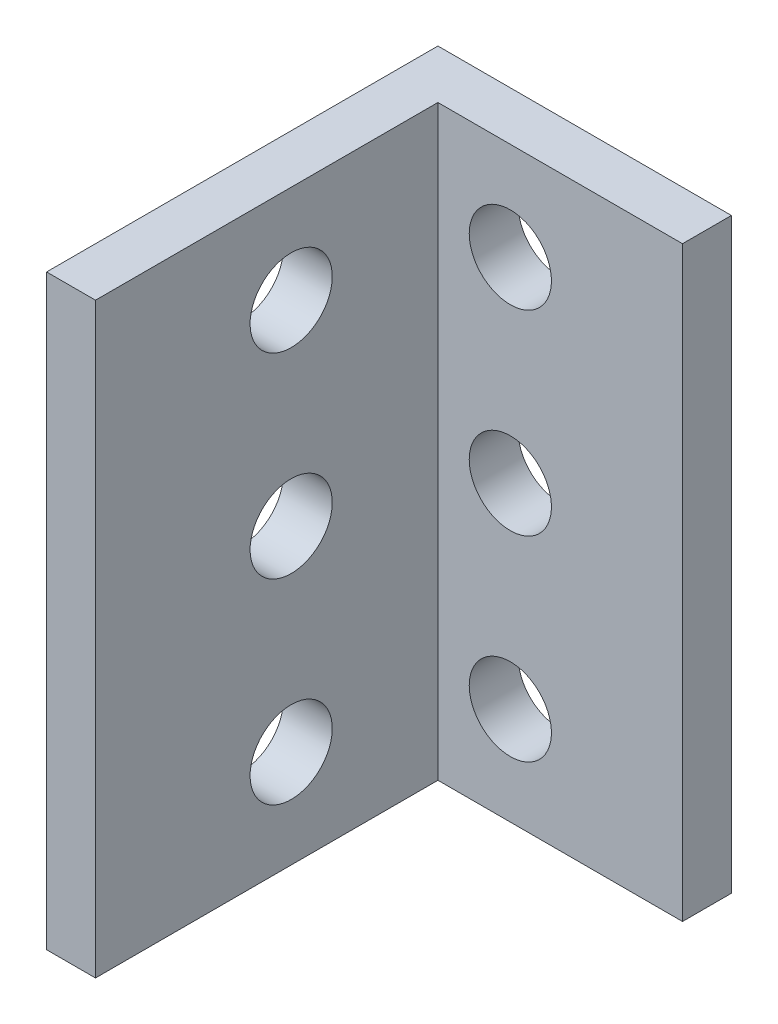
ISO-10303-21;
HEADER;
FILE_DESCRIPTION(('STEP AP214'),'2;1');
FILE_NAME('part.step','',(''),(''),'','','');
FILE_SCHEMA(('AUTOMOTIVE_DESIGN { 1 0 10303 214 1 1 1 1 }'));
ENDSEC;
DATA;
#1=APPLICATION_CONTEXT('core data for automotive mechanical design processes');
#2=APPLICATION_PROTOCOL_DEFINITION('international standard','automotive_design',2000,#1);
#3=PRODUCT_CONTEXT('',#1,'mechanical');
#4=PRODUCT('Part','Part','',(#3));
#5=PRODUCT_RELATED_PRODUCT_CATEGORY('part','',(#4));
#6=PRODUCT_DEFINITION_FORMATION('','',#4);
#7=PRODUCT_DEFINITION_CONTEXT('part definition',#1,'design');
#8=PRODUCT_DEFINITION('design','',#6,#7);
#9=PRODUCT_DEFINITION_SHAPE('','',#8);
#10=(LENGTH_UNIT() NAMED_UNIT(*) SI_UNIT(.MILLI.,.METRE.));
#11=(NAMED_UNIT(*) PLANE_ANGLE_UNIT() SI_UNIT($,.RADIAN.));
#12=(NAMED_UNIT(*) SI_UNIT($,.STERADIAN.) SOLID_ANGLE_UNIT());
#13=UNCERTAINTY_MEASURE_WITH_UNIT(LENGTH_MEASURE(1.E-05),#10,'distance_accuracy_value','');
#14=(GEOMETRIC_REPRESENTATION_CONTEXT(3) GLOBAL_UNCERTAINTY_ASSIGNED_CONTEXT((#13)) GLOBAL_UNIT_ASSIGNED_CONTEXT((#10,
#11,#12)) REPRESENTATION_CONTEXT('',''));
#15=CARTESIAN_POINT('',(0.,0.,0.));
#16=DIRECTION('',(0.,0.,1.));
#17=DIRECTION('',(1.,0.,0.));
#18=AXIS2_PLACEMENT_3D('',#15,#16,#17);
#19=CARTESIAN_POINT('',(0.,0.,3.175));
#20=DIRECTION('',(0.,0.,1.));
#21=DIRECTION('',(1.,0.,0.));
#22=AXIS2_PLACEMENT_3D('',#19,#20,#21);
#23=PLANE('',#22);
#24=DIRECTION('',(0.,1.,0.));
#25=VECTOR('',#24,1.);
#26=CARTESIAN_POINT('',(-3.17500000000001,19.05,3.175));
#27=LINE('',#26,#25);
#28=CARTESIAN_POINT('',(-3.175,-19.05,3.175));
#29=VERTEX_POINT('',#28);
#30=CARTESIAN_POINT('',(-3.17500000000001,19.05,3.175));
#31=VERTEX_POINT('',#30);
#32=EDGE_CURVE('E61',#29,#31,#27,.T.);
#33=ORIENTED_EDGE('',*,*,#32,.F.);
#34=DIRECTION('',(1.,0.,0.));
#35=VECTOR('',#34,1.);
#36=CARTESIAN_POINT('',(-6.35,-19.05,3.175));
#37=LINE('',#36,#35);
#38=CARTESIAN_POINT('',(12.7,-19.05,3.175));
#39=VERTEX_POINT('',#38);
#40=EDGE_CURVE('E66',#29,#39,#37,.T.);
#41=ORIENTED_EDGE('',*,*,#40,.T.);
#42=DIRECTION('',(0.,1.,0.));
#43=VECTOR('',#42,1.);
#44=CARTESIAN_POINT('',(12.7,19.05,3.175));
#45=LINE('',#44,#43);
#46=CARTESIAN_POINT('',(12.7,19.05,3.175));
#47=VERTEX_POINT('',#46);
#48=EDGE_CURVE('E98',#39,#47,#45,.T.);
#49=ORIENTED_EDGE('',*,*,#48,.T.);
#50=DIRECTION('',(-1.,0.,0.));
#51=VECTOR('',#50,1.);
#52=CARTESIAN_POINT('',(-6.35000000000001,19.05,3.175));
#53=LINE('',#52,#51);
#54=EDGE_CURVE('E186',#47,#31,#53,.T.);
#55=ORIENTED_EDGE('',*,*,#54,.T.);
#56=EDGE_LOOP('',(#33,#41,#49,#55));
#57=FACE_BOUND('',#56,.T.);
#58=CARTESIAN_POINT('',(1.52399999999999,0.,3.175));
#59=DIRECTION('',(0.,0.,1.));
#60=DIRECTION('',(-1.,0.,0.));
#61=AXIS2_PLACEMENT_3D('',#58,#59,#60);
#62=CIRCLE('',#61,2.667);
#63=CARTESIAN_POINT('',(-1.14300000000001,0.,3.175));
#64=VERTEX_POINT('',#63);
#65=EDGE_CURVE('E175',#64,#64,#62,.T.);
#66=ORIENTED_EDGE('',*,*,#65,.F.);
#67=EDGE_LOOP('',(#66));
#68=FACE_BOUND('',#67,.T.);
#69=CARTESIAN_POINT('',(1.52399999999999,-12.7,3.175));
#70=DIRECTION('',(0.,0.,1.));
#71=DIRECTION('',(-1.,0.,0.));
#72=AXIS2_PLACEMENT_3D('',#69,#70,#71);
#73=CIRCLE('',#72,2.66699999999999);
#74=CARTESIAN_POINT('',(-1.14300000000001,-12.7,3.175));
#75=VERTEX_POINT('',#74);
#76=EDGE_CURVE('E111',#75,#75,#73,.T.);
#77=ORIENTED_EDGE('',*,*,#76,.F.);
#78=EDGE_LOOP('',(#77));
#79=FACE_BOUND('',#78,.T.);
#80=CARTESIAN_POINT('',(1.52399999999999,12.7,3.175));
#81=DIRECTION('',(0.,0.,1.));
#82=DIRECTION('',(-1.,0.,0.));
#83=AXIS2_PLACEMENT_3D('',#80,#81,#82);
#84=CIRCLE('',#83,2.667);
#85=CARTESIAN_POINT('',(-1.14300000000001,12.7,3.175));
#86=VERTEX_POINT('',#85);
#87=EDGE_CURVE('E167',#86,#86,#84,.T.);
#88=ORIENTED_EDGE('',*,*,#87,.F.);
#89=EDGE_LOOP('',(#88));
#90=FACE_BOUND('',#89,.T.);
#91=ADVANCED_FACE('F45',(#57,#68,#79,#90),#23,.T.);
#92=CARTESIAN_POINT('',(0.,0.,0.));
#93=DIRECTION('',(0.,0.,1.));
#94=DIRECTION('',(1.,0.,0.));
#95=AXIS2_PLACEMENT_3D('',#92,#93,#94);
#96=PLANE('',#95);
#97=DIRECTION('',(0.,1.,0.));
#98=VECTOR('',#97,1.);
#99=CARTESIAN_POINT('',(12.7,19.05,0.));
#100=LINE('',#99,#98);
#101=CARTESIAN_POINT('',(12.7,-19.05,0.));
#102=VERTEX_POINT('',#101);
#103=CARTESIAN_POINT('',(12.7,19.05,0.));
#104=VERTEX_POINT('',#103);
#105=EDGE_CURVE('E104',#102,#104,#100,.T.);
#106=ORIENTED_EDGE('',*,*,#105,.F.);
#107=DIRECTION('',(1.,0.,0.));
#108=VECTOR('',#107,1.);
#109=CARTESIAN_POINT('',(-6.35,-19.05,0.));
#110=LINE('',#109,#108);
#111=CARTESIAN_POINT('',(-6.35,-19.05,0.));
#112=VERTEX_POINT('',#111);
#113=EDGE_CURVE('E86',#112,#102,#110,.T.);
#114=ORIENTED_EDGE('',*,*,#113,.F.);
#115=DIRECTION('',(0.,-1.,0.));
#116=VECTOR('',#115,1.);
#117=CARTESIAN_POINT('',(-6.35000000000001,19.05,0.));
#118=LINE('',#117,#116);
#119=CARTESIAN_POINT('',(-6.35000000000001,19.05,0.));
#120=VERTEX_POINT('',#119);
#121=EDGE_CURVE('E99',#120,#112,#118,.T.);
#122=ORIENTED_EDGE('',*,*,#121,.F.);
#123=DIRECTION('',(-1.,0.,0.));
#124=VECTOR('',#123,1.);
#125=CARTESIAN_POINT('',(-6.35000000000001,19.05,0.));
#126=LINE('',#125,#124);
#127=EDGE_CURVE('E109',#104,#120,#126,.T.);
#128=ORIENTED_EDGE('',*,*,#127,.F.);
#129=EDGE_LOOP('',(#106,#114,#122,#128));
#130=FACE_BOUND('',#129,.T.);
#131=CARTESIAN_POINT('',(1.52399999999999,-12.7,0.));
#132=DIRECTION('',(0.,0.,1.));
#133=DIRECTION('',(-1.,0.,0.));
#134=AXIS2_PLACEMENT_3D('',#131,#132,#133);
#135=CIRCLE('',#134,2.66699999999999);
#136=CARTESIAN_POINT('',(-1.14300000000001,-12.7,0.));
#137=VERTEX_POINT('',#136);
#138=EDGE_CURVE('E117',#137,#137,#135,.T.);
#139=ORIENTED_EDGE('',*,*,#138,.T.);
#140=EDGE_LOOP('',(#139));
#141=FACE_BOUND('',#140,.T.);
#142=CARTESIAN_POINT('',(1.52399999999999,0.,0.));
#143=DIRECTION('',(0.,0.,1.));
#144=DIRECTION('',(-1.,0.,0.));
#145=AXIS2_PLACEMENT_3D('',#142,#143,#144);
#146=CIRCLE('',#145,2.667);
#147=CARTESIAN_POINT('',(-1.14300000000001,0.,0.));
#148=VERTEX_POINT('',#147);
#149=EDGE_CURVE('E171',#148,#148,#146,.T.);
#150=ORIENTED_EDGE('',*,*,#149,.T.);
#151=EDGE_LOOP('',(#150));
#152=FACE_BOUND('',#151,.T.);
#153=CARTESIAN_POINT('',(1.52399999999999,12.7,0.));
#154=DIRECTION('',(0.,0.,1.));
#155=DIRECTION('',(-1.,0.,0.));
#156=AXIS2_PLACEMENT_3D('',#153,#154,#155);
#157=CIRCLE('',#156,2.667);
#158=CARTESIAN_POINT('',(-1.14300000000001,12.7,0.));
#159=VERTEX_POINT('',#158);
#160=EDGE_CURVE('E166',#159,#159,#157,.T.);
#161=ORIENTED_EDGE('',*,*,#160,.T.);
#162=EDGE_LOOP('',(#161));
#163=FACE_BOUND('',#162,.T.);
#164=ADVANCED_FACE('F107',(#130,#141,#152,#163),#96,.F.);
#165=CARTESIAN_POINT('',(12.7,19.05,3.175));
#166=DIRECTION('',(-1.,0.,0.));
#167=DIRECTION('',(0.,-1.,0.));
#168=AXIS2_PLACEMENT_3D('',#165,#166,#167);
#169=PLANE('',#168);
#170=ORIENTED_EDGE('',*,*,#105,.T.);
#171=DIRECTION('',(0.,0.,-1.));
#172=VECTOR('',#171,1.);
#173=CARTESIAN_POINT('',(12.7,19.05,3.175));
#174=LINE('',#173,#172);
#175=EDGE_CURVE('E11',#47,#104,#174,.T.);
#176=ORIENTED_EDGE('',*,*,#175,.F.);
#177=ORIENTED_EDGE('',*,*,#48,.F.);
#178=DIRECTION('',(0.,0.,-1.));
#179=VECTOR('',#178,1.);
#180=CARTESIAN_POINT('',(12.7,-19.05,3.175));
#181=LINE('',#180,#179);
#182=EDGE_CURVE('E89',#39,#102,#181,.T.);
#183=ORIENTED_EDGE('',*,*,#182,.T.);
#184=EDGE_LOOP('',(#170,#176,#177,#183));
#185=FACE_BOUND('',#184,.T.);
#186=ADVANCED_FACE('F47',(#185),#169,.F.);
#187=CARTESIAN_POINT('',(-6.35000000000001,19.05,3.175));
#188=DIRECTION('',(0.,-1.,0.));
#189=DIRECTION('',(1.,0.,0.));
#190=AXIS2_PLACEMENT_3D('',#187,#188,#189);
#191=PLANE('',#190);
#192=ORIENTED_EDGE('',*,*,#127,.T.);
#193=DIRECTION('',(0.,0.,-1.));
#194=VECTOR('',#193,1.);
#195=CARTESIAN_POINT('',(-6.35000000000001,19.05,3.175));
#196=LINE('',#195,#194);
#197=CARTESIAN_POINT('',(-6.35000000000001,19.05,25.4));
#198=VERTEX_POINT('',#197);
#199=EDGE_CURVE('E54',#198,#120,#196,.T.);
#200=ORIENTED_EDGE('',*,*,#199,.F.);
#201=DIRECTION('',(-1.,0.,0.));
#202=VECTOR('',#201,1.);
#203=CARTESIAN_POINT('',(-6.35000000000001,19.05,25.4));
#204=LINE('',#203,#202);
#205=CARTESIAN_POINT('',(-3.17500000000001,19.05,25.4));
#206=VERTEX_POINT('',#205);
#207=EDGE_CURVE('E139',#206,#198,#204,.T.);
#208=ORIENTED_EDGE('',*,*,#207,.F.);
#209=DIRECTION('',(0.,0.,-1.));
#210=VECTOR('',#209,1.);
#211=CARTESIAN_POINT('',(-3.17500000000001,19.05,25.4));
#212=LINE('',#211,#210);
#213=EDGE_CURVE('E150',#206,#31,#212,.T.);
#214=ORIENTED_EDGE('',*,*,#213,.T.);
#215=ORIENTED_EDGE('',*,*,#54,.F.);
#216=ORIENTED_EDGE('',*,*,#175,.T.);
#217=EDGE_LOOP('',(#192,#200,#208,#214,#215,#216));
#218=FACE_BOUND('',#217,.T.);
#219=ADVANCED_FACE('F136',(#218),#191,.F.);
#220=CARTESIAN_POINT('',(-6.35000000000001,19.05,3.175));
#221=DIRECTION('',(1.,0.,0.));
#222=DIRECTION('',(0.,1.,0.));
#223=AXIS2_PLACEMENT_3D('',#220,#221,#222);
#224=PLANE('',#223);
#225=CARTESIAN_POINT('',(-6.35000000000001,12.7,12.7));
#226=DIRECTION('',(1.,0.,0.));
#227=DIRECTION('',(0.,1.,0.));
#228=AXIS2_PLACEMENT_3D('',#225,#226,#227);
#229=CIRCLE('',#228,2.667);
#230=CARTESIAN_POINT('',(-6.35000000000001,15.367,12.7));
#231=VERTEX_POINT('',#230);
#232=EDGE_CURVE('E161',#231,#231,#229,.T.);
#233=ORIENTED_EDGE('',*,*,#232,.T.);
#234=EDGE_LOOP('',(#233));
#235=FACE_BOUND('',#234,.T.);
#236=CARTESIAN_POINT('',(-6.35000000000001,-12.7,12.7));
#237=DIRECTION('',(1.,0.,0.));
#238=DIRECTION('',(0.,1.,0.));
#239=AXIS2_PLACEMENT_3D('',#236,#237,#238);
#240=CIRCLE('',#239,2.667);
#241=CARTESIAN_POINT('',(-6.35000000000001,-10.033,12.7));
#242=VERTEX_POINT('',#241);
#243=EDGE_CURVE('E214',#242,#242,#240,.T.);
#244=ORIENTED_EDGE('',*,*,#243,.T.);
#245=EDGE_LOOP('',(#244));
#246=FACE_BOUND('',#245,.T.);
#247=CARTESIAN_POINT('',(-6.35000000000001,0.,12.7));
#248=DIRECTION('',(1.,0.,0.));
#249=DIRECTION('',(0.,1.,0.));
#250=AXIS2_PLACEMENT_3D('',#247,#248,#249);
#251=CIRCLE('',#250,2.667);
#252=CARTESIAN_POINT('',(-6.35000000000001,2.667,12.7));
#253=VERTEX_POINT('',#252);
#254=EDGE_CURVE('E206',#253,#253,#251,.T.);
#255=ORIENTED_EDGE('',*,*,#254,.T.);
#256=EDGE_LOOP('',(#255));
#257=FACE_BOUND('',#256,.T.);
#258=ORIENTED_EDGE('',*,*,#121,.T.);
#259=DIRECTION('',(0.,0.,-1.));
#260=VECTOR('',#259,1.);
#261=CARTESIAN_POINT('',(-6.35,-19.05,3.175));
#262=LINE('',#261,#260);
#263=CARTESIAN_POINT('',(-6.35,-19.05,25.4));
#264=VERTEX_POINT('',#263);
#265=EDGE_CURVE('E93',#264,#112,#262,.T.);
#266=ORIENTED_EDGE('',*,*,#265,.F.);
#267=DIRECTION('',(0.,-1.,0.));
#268=VECTOR('',#267,1.);
#269=CARTESIAN_POINT('',(-6.35000000000001,19.05,25.4));
#270=LINE('',#269,#268);
#271=EDGE_CURVE('E132',#198,#264,#270,.T.);
#272=ORIENTED_EDGE('',*,*,#271,.F.);
#273=ORIENTED_EDGE('',*,*,#199,.T.);
#274=EDGE_LOOP('',(#258,#266,#272,#273));
#275=FACE_BOUND('',#274,.T.);
#276=ADVANCED_FACE('F130',(#235,#246,#257,#275),#224,.F.);
#277=CARTESIAN_POINT('',(-6.35,-19.05,3.175));
#278=DIRECTION('',(0.,1.,0.));
#279=DIRECTION('',(-1.,0.,0.));
#280=AXIS2_PLACEMENT_3D('',#277,#278,#279);
#281=PLANE('',#280);
#282=ORIENTED_EDGE('',*,*,#113,.T.);
#283=ORIENTED_EDGE('',*,*,#182,.F.);
#284=ORIENTED_EDGE('',*,*,#40,.F.);
#285=DIRECTION('',(0.,0.,-1.));
#286=VECTOR('',#285,1.);
#287=CARTESIAN_POINT('',(-3.175,-19.05,25.4));
#288=LINE('',#287,#286);
#289=CARTESIAN_POINT('',(-3.175,-19.05,25.4));
#290=VERTEX_POINT('',#289);
#291=EDGE_CURVE('E154',#290,#29,#288,.T.);
#292=ORIENTED_EDGE('',*,*,#291,.F.);
#293=DIRECTION('',(1.,0.,0.));
#294=VECTOR('',#293,1.);
#295=CARTESIAN_POINT('',(-6.35,-19.05,25.4));
#296=LINE('',#295,#294);
#297=EDGE_CURVE('E156',#264,#290,#296,.T.);
#298=ORIENTED_EDGE('',*,*,#297,.F.);
#299=ORIENTED_EDGE('',*,*,#265,.T.);
#300=EDGE_LOOP('',(#282,#283,#284,#292,#298,#299));
#301=FACE_BOUND('',#300,.T.);
#302=ADVANCED_FACE('F88',(#301),#281,.F.);
#303=CARTESIAN_POINT('',(1.52399999999999,-12.7,3.175));
#304=DIRECTION('',(0.,0.,-1.));
#305=DIRECTION('',(-1.,0.,0.));
#306=AXIS2_PLACEMENT_3D('',#303,#304,#305);
#307=CYLINDRICAL_SURFACE('',#306,2.66699999999999);
#308=ORIENTED_EDGE('',*,*,#76,.T.);
#309=EDGE_LOOP('',(#308));
#310=FACE_BOUND('',#309,.T.);
#311=ORIENTED_EDGE('',*,*,#138,.F.);
#312=EDGE_LOOP('',(#311));
#313=FACE_BOUND('',#312,.T.);
#314=ADVANCED_FACE('F264',(#310,#313),#307,.F.);
#315=CARTESIAN_POINT('',(1.52399999999999,0.,3.175));
#316=DIRECTION('',(0.,0.,-1.));
#317=DIRECTION('',(-1.,0.,0.));
#318=AXIS2_PLACEMENT_3D('',#315,#316,#317);
#319=CYLINDRICAL_SURFACE('',#318,2.667);
#320=ORIENTED_EDGE('',*,*,#65,.T.);
#321=EDGE_LOOP('',(#320));
#322=FACE_BOUND('',#321,.T.);
#323=ORIENTED_EDGE('',*,*,#149,.F.);
#324=EDGE_LOOP('',(#323));
#325=FACE_BOUND('',#324,.T.);
#326=ADVANCED_FACE('F285',(#322,#325),#319,.F.);
#327=CARTESIAN_POINT('',(1.52399999999999,12.7,3.175));
#328=DIRECTION('',(0.,0.,-1.));
#329=DIRECTION('',(-1.,0.,0.));
#330=AXIS2_PLACEMENT_3D('',#327,#328,#329);
#331=CYLINDRICAL_SURFACE('',#330,2.667);
#332=ORIENTED_EDGE('',*,*,#87,.T.);
#333=EDGE_LOOP('',(#332));
#334=FACE_BOUND('',#333,.T.);
#335=ORIENTED_EDGE('',*,*,#160,.F.);
#336=EDGE_LOOP('',(#335));
#337=FACE_BOUND('',#336,.T.);
#338=ADVANCED_FACE('F237',(#334,#337),#331,.F.);
#339=CARTESIAN_POINT('',(-3.17500000000001,19.05,25.4));
#340=DIRECTION('',(-1.,0.,0.));
#341=DIRECTION('',(0.,-1.,0.));
#342=AXIS2_PLACEMENT_3D('',#339,#340,#341);
#343=PLANE('',#342);
#344=CARTESIAN_POINT('',(-3.17500000000001,12.7,12.7));
#345=DIRECTION('',(1.,0.,0.));
#346=DIRECTION('',(0.,1.,0.));
#347=AXIS2_PLACEMENT_3D('',#344,#345,#346);
#348=CIRCLE('',#347,2.667);
#349=CARTESIAN_POINT('',(-3.17500000000001,15.367,12.7));
#350=VERTEX_POINT('',#349);
#351=EDGE_CURVE('E218',#350,#350,#348,.T.);
#352=ORIENTED_EDGE('',*,*,#351,.F.);
#353=EDGE_LOOP('',(#352));
#354=FACE_BOUND('',#353,.T.);
#355=CARTESIAN_POINT('',(-3.175,-12.7,12.7));
#356=DIRECTION('',(1.,0.,0.));
#357=DIRECTION('',(0.,1.,0.));
#358=AXIS2_PLACEMENT_3D('',#355,#356,#357);
#359=CIRCLE('',#358,2.667);
#360=CARTESIAN_POINT('',(-3.175,-10.033,12.7));
#361=VERTEX_POINT('',#360);
#362=EDGE_CURVE('E210',#361,#361,#359,.T.);
#363=ORIENTED_EDGE('',*,*,#362,.F.);
#364=EDGE_LOOP('',(#363));
#365=FACE_BOUND('',#364,.T.);
#366=CARTESIAN_POINT('',(-3.175,0.,12.7));
#367=DIRECTION('',(1.,0.,0.));
#368=DIRECTION('',(0.,1.,0.));
#369=AXIS2_PLACEMENT_3D('',#366,#367,#368);
#370=CIRCLE('',#369,2.667);
#371=CARTESIAN_POINT('',(-3.175,2.667,12.7));
#372=VERTEX_POINT('',#371);
#373=EDGE_CURVE('E202',#372,#372,#370,.T.);
#374=ORIENTED_EDGE('',*,*,#373,.F.);
#375=EDGE_LOOP('',(#374));
#376=FACE_BOUND('',#375,.T.);
#377=ORIENTED_EDGE('',*,*,#32,.T.);
#378=ORIENTED_EDGE('',*,*,#213,.F.);
#379=DIRECTION('',(0.,1.,0.));
#380=VECTOR('',#379,1.);
#381=CARTESIAN_POINT('',(-3.17500000000001,19.05,25.4));
#382=LINE('',#381,#380);
#383=EDGE_CURVE('E147',#290,#206,#382,.T.);
#384=ORIENTED_EDGE('',*,*,#383,.F.);
#385=ORIENTED_EDGE('',*,*,#291,.T.);
#386=EDGE_LOOP('',(#377,#378,#384,#385));
#387=FACE_BOUND('',#386,.T.);
#388=ADVANCED_FACE('F192',(#354,#365,#376,#387),#343,.F.);
#389=CARTESIAN_POINT('',(0.,0.,25.4));
#390=DIRECTION('',(0.,0.,1.));
#391=DIRECTION('',(1.,0.,0.));
#392=AXIS2_PLACEMENT_3D('',#389,#390,#391);
#393=PLANE('',#392);
#394=ORIENTED_EDGE('',*,*,#271,.T.);
#395=ORIENTED_EDGE('',*,*,#297,.T.);
#396=ORIENTED_EDGE('',*,*,#383,.T.);
#397=ORIENTED_EDGE('',*,*,#207,.T.);
#398=EDGE_LOOP('',(#394,#395,#396,#397));
#399=FACE_BOUND('',#398,.T.);
#400=ADVANCED_FACE('F143',(#399),#393,.T.);
#401=CARTESIAN_POINT('',(-6.35000000000001,0.,12.7));
#402=DIRECTION('',(1.,0.,0.));
#403=DIRECTION('',(0.,1.,0.));
#404=AXIS2_PLACEMENT_3D('',#401,#402,#403);
#405=CYLINDRICAL_SURFACE('',#404,2.667);
#406=ORIENTED_EDGE('',*,*,#254,.F.);
#407=EDGE_LOOP('',(#406));
#408=FACE_BOUND('',#407,.T.);
#409=ORIENTED_EDGE('',*,*,#373,.T.);
#410=EDGE_LOOP('',(#409));
#411=FACE_BOUND('',#410,.T.);
#412=ADVANCED_FACE('F243',(#408,#411),#405,.F.);
#413=CARTESIAN_POINT('',(-6.35000000000001,-12.7,12.7));
#414=DIRECTION('',(1.,0.,0.));
#415=DIRECTION('',(0.,1.,0.));
#416=AXIS2_PLACEMENT_3D('',#413,#414,#415);
#417=CYLINDRICAL_SURFACE('',#416,2.667);
#418=ORIENTED_EDGE('',*,*,#243,.F.);
#419=EDGE_LOOP('',(#418));
#420=FACE_BOUND('',#419,.T.);
#421=ORIENTED_EDGE('',*,*,#362,.T.);
#422=EDGE_LOOP('',(#421));
#423=FACE_BOUND('',#422,.T.);
#424=ADVANCED_FACE('F231',(#420,#423),#417,.F.);
#425=CARTESIAN_POINT('',(-6.35000000000001,12.7,12.7));
#426=DIRECTION('',(1.,0.,0.));
#427=DIRECTION('',(0.,1.,0.));
#428=AXIS2_PLACEMENT_3D('',#425,#426,#427);
#429=CYLINDRICAL_SURFACE('',#428,2.667);
#430=ORIENTED_EDGE('',*,*,#232,.F.);
#431=EDGE_LOOP('',(#430));
#432=FACE_BOUND('',#431,.T.);
#433=ORIENTED_EDGE('',*,*,#351,.T.);
#434=EDGE_LOOP('',(#433));
#435=FACE_BOUND('',#434,.T.);
#436=ADVANCED_FACE('F228',(#432,#435),#429,.F.);
#437=CLOSED_SHELL('',(#91,#164,#186,#219,#276,#302,#314,#326,#338,#388,#400,#412,#424,#436));
#438=MANIFOLD_SOLID_BREP('B2',#437);
#439=ADVANCED_BREP_SHAPE_REPRESENTATION('',(#18,#438),#14);
#440=SHAPE_DEFINITION_REPRESENTATION(#9,#439);
ENDSEC;
END-ISO-10303-21;
